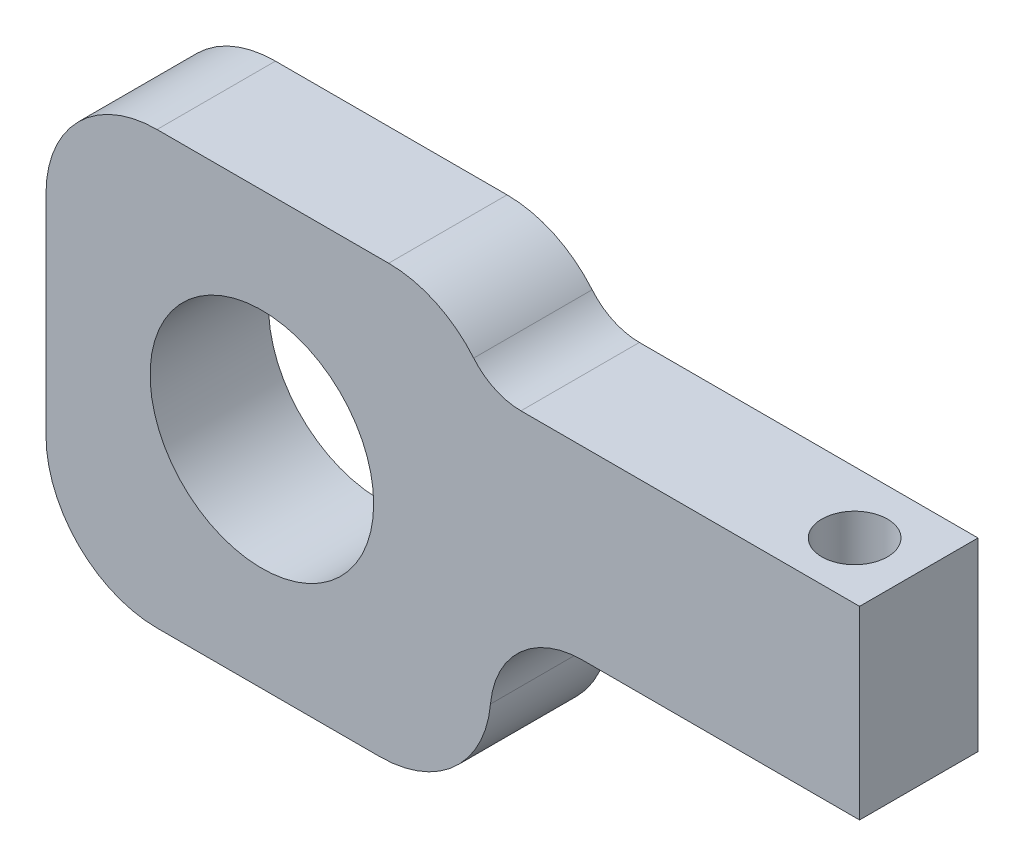
ISO-10303-21;
HEADER;
FILE_DESCRIPTION(('STEP AP214'),'2;1');
FILE_NAME('part.step','',(''),(''),'','','');
FILE_SCHEMA(('AUTOMOTIVE_DESIGN { 1 0 10303 214 1 1 1 1 }'));
ENDSEC;
DATA;
#1=APPLICATION_CONTEXT('core data for automotive mechanical design processes');
#2=APPLICATION_PROTOCOL_DEFINITION('international standard','automotive_design',2000,#1);
#3=PRODUCT_CONTEXT('',#1,'mechanical');
#4=PRODUCT('Part','Part','',(#3));
#5=PRODUCT_RELATED_PRODUCT_CATEGORY('part','',(#4));
#6=PRODUCT_DEFINITION_FORMATION('','',#4);
#7=PRODUCT_DEFINITION_CONTEXT('part definition',#1,'design');
#8=PRODUCT_DEFINITION('design','',#6,#7);
#9=PRODUCT_DEFINITION_SHAPE('','',#8);
#10=(LENGTH_UNIT() NAMED_UNIT(*) SI_UNIT(.MILLI.,.METRE.));
#11=(NAMED_UNIT(*) PLANE_ANGLE_UNIT() SI_UNIT($,.RADIAN.));
#12=(NAMED_UNIT(*) SI_UNIT($,.STERADIAN.) SOLID_ANGLE_UNIT());
#13=UNCERTAINTY_MEASURE_WITH_UNIT(LENGTH_MEASURE(1.E-05),#10,'distance_accuracy_value','');
#14=(GEOMETRIC_REPRESENTATION_CONTEXT(3) GLOBAL_UNCERTAINTY_ASSIGNED_CONTEXT((#13)) GLOBAL_UNIT_ASSIGNED_CONTEXT((#10,
#11,#12)) REPRESENTATION_CONTEXT('',''));
#15=CARTESIAN_POINT('',(0.,0.,0.));
#16=DIRECTION('',(0.,0.,1.));
#17=DIRECTION('',(1.,0.,0.));
#18=AXIS2_PLACEMENT_3D('',#15,#16,#17);
#19=CARTESIAN_POINT('',(0.,0.,6.096));
#20=DIRECTION('',(1.,0.,0.));
#21=DIRECTION('',(0.,1.,0.));
#22=AXIS2_PLACEMENT_3D('',#19,#20,#21);
#23=PLANE('',#22);
#24=DIRECTION('',(0.,-1.,0.));
#25=VECTOR('',#24,1.);
#26=CARTESIAN_POINT('',(0.,0.,-6.096));
#27=LINE('',#26,#25);
#28=CARTESIAN_POINT('',(0.,-11.43,-6.096));
#29=VERTEX_POINT('',#28);
#30=CARTESIAN_POINT('',(0.,-33.02,-6.096));
#31=VERTEX_POINT('',#30);
#32=EDGE_CURVE('E185',#29,#31,#27,.T.);
#33=ORIENTED_EDGE('',*,*,#32,.T.);
#34=DIRECTION('',(0.,0.,-1.));
#35=VECTOR('',#34,1.);
#36=CARTESIAN_POINT('',(0.,-33.02,6.096));
#37=LINE('',#36,#35);
#38=CARTESIAN_POINT('',(0.,-33.02,6.096));
#39=VERTEX_POINT('',#38);
#40=EDGE_CURVE('E11',#31,#39,#37,.F.);
#41=ORIENTED_EDGE('',*,*,#40,.T.);
#42=DIRECTION('',(0.,-1.,0.));
#43=VECTOR('',#42,1.);
#44=CARTESIAN_POINT('',(0.,0.,6.096));
#45=LINE('',#44,#43);
#46=CARTESIAN_POINT('',(0.,-11.43,6.096));
#47=VERTEX_POINT('',#46);
#48=EDGE_CURVE('E186',#47,#39,#45,.T.);
#49=ORIENTED_EDGE('',*,*,#48,.F.);
#50=DIRECTION('',(0.,0.,-1.));
#51=VECTOR('',#50,1.);
#52=CARTESIAN_POINT('',(0.,-11.43,6.096));
#53=LINE('',#52,#51);
#54=EDGE_CURVE('E44',#47,#29,#53,.T.);
#55=ORIENTED_EDGE('',*,*,#54,.T.);
#56=EDGE_LOOP('',(#33,#41,#49,#55));
#57=FACE_BOUND('',#56,.T.);
#58=ADVANCED_FACE('F36',(#57),#23,.F.);
#59=CARTESIAN_POINT('',(0.,-44.45,6.096));
#60=DIRECTION('',(0.,1.,0.));
#61=DIRECTION('',(0.,0.,1.));
#62=AXIS2_PLACEMENT_3D('',#59,#60,#61);
#63=PLANE('',#62);
#64=DIRECTION('',(1.,0.,0.));
#65=VECTOR('',#64,1.);
#66=CARTESIAN_POINT('',(0.,-44.45,-6.096));
#67=LINE('',#66,#65);
#68=CARTESIAN_POINT('',(11.43,-44.45,-6.096));
#69=VERTEX_POINT('',#68);
#70=CARTESIAN_POINT('',(34.3767705590532,-44.45,-6.096));
#71=VERTEX_POINT('',#70);
#72=EDGE_CURVE('E198',#69,#71,#67,.T.);
#73=ORIENTED_EDGE('',*,*,#72,.T.);
#74=DIRECTION('',(0.,0.,1.));
#75=VECTOR('',#74,1.);
#76=CARTESIAN_POINT('',(34.3767705590532,-44.45,6.096));
#77=LINE('',#76,#75);
#78=CARTESIAN_POINT('',(34.3767705590532,-44.45,6.096));
#79=VERTEX_POINT('',#78);
#80=EDGE_CURVE('E226',#71,#79,#77,.T.);
#81=ORIENTED_EDGE('',*,*,#80,.T.);
#82=DIRECTION('',(1.,0.,0.));
#83=VECTOR('',#82,1.);
#84=CARTESIAN_POINT('',(0.,-44.45,6.096));
#85=LINE('',#84,#83);
#86=CARTESIAN_POINT('',(11.43,-44.45,6.096));
#87=VERTEX_POINT('',#86);
#88=EDGE_CURVE('E189',#87,#79,#85,.T.);
#89=ORIENTED_EDGE('',*,*,#88,.F.);
#90=DIRECTION('',(0.,0.,-1.));
#91=VECTOR('',#90,1.);
#92=CARTESIAN_POINT('',(11.43,-44.45,6.096));
#93=LINE('',#92,#91);
#94=EDGE_CURVE('E223',#87,#69,#93,.T.);
#95=ORIENTED_EDGE('',*,*,#94,.T.);
#96=EDGE_LOOP('',(#73,#81,#89,#95));
#97=FACE_BOUND('',#96,.T.);
#98=ADVANCED_FACE('F265',(#97),#63,.F.);
#99=CARTESIAN_POINT('',(0.,0.,6.096));
#100=DIRECTION('',(0.,-1.,0.));
#101=DIRECTION('',(0.,0.,-1.));
#102=AXIS2_PLACEMENT_3D('',#99,#100,#101);
#103=PLANE('',#102);
#104=DIRECTION('',(-1.,0.,0.));
#105=VECTOR('',#104,1.);
#106=CARTESIAN_POINT('',(0.,0.,6.096));
#107=LINE('',#106,#105);
#108=CARTESIAN_POINT('',(35.2757672756502,0.,6.096));
#109=VERTEX_POINT('',#108);
#110=CARTESIAN_POINT('',(11.43,0.,6.096));
#111=VERTEX_POINT('',#110);
#112=EDGE_CURVE('E193',#109,#111,#107,.T.);
#113=ORIENTED_EDGE('',*,*,#112,.F.);
#114=DIRECTION('',(0.,0.,1.));
#115=VECTOR('',#114,1.);
#116=CARTESIAN_POINT('',(35.2757672756502,0.,6.096));
#117=LINE('',#116,#115);
#118=CARTESIAN_POINT('',(35.2757672756502,0.,-6.096));
#119=VERTEX_POINT('',#118);
#120=EDGE_CURVE('E215',#109,#119,#117,.F.);
#121=ORIENTED_EDGE('',*,*,#120,.T.);
#122=DIRECTION('',(-1.,0.,0.));
#123=VECTOR('',#122,1.);
#124=CARTESIAN_POINT('',(0.,0.,-6.096));
#125=LINE('',#124,#123);
#126=CARTESIAN_POINT('',(11.43,0.,-6.096));
#127=VERTEX_POINT('',#126);
#128=EDGE_CURVE('E190',#119,#127,#125,.T.);
#129=ORIENTED_EDGE('',*,*,#128,.T.);
#130=DIRECTION('',(0.,0.,-1.));
#131=VECTOR('',#130,1.);
#132=CARTESIAN_POINT('',(11.43,0.,6.096));
#133=LINE('',#132,#131);
#134=EDGE_CURVE('E213',#127,#111,#133,.F.);
#135=ORIENTED_EDGE('',*,*,#134,.T.);
#136=EDGE_LOOP('',(#113,#121,#129,#135));
#137=FACE_BOUND('',#136,.T.);
#138=ADVANCED_FACE('F239',(#137),#103,.F.);
#139=CARTESIAN_POINT('',(0.,0.,6.096));
#140=DIRECTION('',(0.,0.,1.));
#141=DIRECTION('',(1.,0.,0.));
#142=AXIS2_PLACEMENT_3D('',#139,#140,#141);
#143=PLANE('',#142);
#144=CARTESIAN_POINT('',(48.895,0.,6.096));
#145=DIRECTION('',(0.,0.,1.));
#146=DIRECTION('',(1.,0.,0.));
#147=AXIS2_PLACEMENT_3D('',#144,#145,#146);
#148=CIRCLE('',#147,6.35);
#149=CARTESIAN_POINT('',(44.0309883127322,-4.08214285714286,6.096));
#150=VERTEX_POINT('',#149);
#151=CARTESIAN_POINT('',(48.895,-6.35,6.096));
#152=VERTEX_POINT('',#151);
#153=EDGE_CURVE('E152',#150,#152,#148,.T.);
#154=ORIENTED_EDGE('',*,*,#153,.F.);
#155=CARTESIAN_POINT('',(35.2757672756502,-11.43,6.096));
#156=DIRECTION('',(0.,0.,1.));
#157=DIRECTION('',(1.,0.,0.));
#158=AXIS2_PLACEMENT_3D('',#155,#156,#157);
#159=CIRCLE('',#158,11.43);
#160=EDGE_CURVE('E211',#150,#109,#159,.T.);
#161=ORIENTED_EDGE('',*,*,#160,.T.);
#162=ORIENTED_EDGE('',*,*,#112,.T.);
#163=CARTESIAN_POINT('',(11.43,-11.43,6.096));
#164=DIRECTION('',(0.,0.,1.));
#165=DIRECTION('',(1.,0.,0.));
#166=AXIS2_PLACEMENT_3D('',#163,#164,#165);
#167=CIRCLE('',#166,11.43);
#168=EDGE_CURVE('E205',#111,#47,#167,.T.);
#169=ORIENTED_EDGE('',*,*,#168,.T.);
#170=ORIENTED_EDGE('',*,*,#48,.T.);
#171=CARTESIAN_POINT('',(11.43,-33.02,6.096));
#172=DIRECTION('',(0.,0.,1.));
#173=DIRECTION('',(1.,0.,0.));
#174=AXIS2_PLACEMENT_3D('',#171,#172,#173);
#175=CIRCLE('',#174,11.43);
#176=EDGE_CURVE('E207',#39,#87,#175,.T.);
#177=ORIENTED_EDGE('',*,*,#176,.T.);
#178=ORIENTED_EDGE('',*,*,#88,.T.);
#179=CARTESIAN_POINT('',(34.3767705590532,-33.02,6.096));
#180=DIRECTION('',(0.,0.,1.));
#181=DIRECTION('',(1.,0.,0.));
#182=AXIS2_PLACEMENT_3D('',#179,#180,#181);
#183=CIRCLE('',#182,11.43);
#184=CARTESIAN_POINT('',(45.759441163206,-34.0590909090909,6.096));
#185=VERTEX_POINT('',#184);
#186=EDGE_CURVE('E209',#79,#185,#183,.T.);
#187=ORIENTED_EDGE('',*,*,#186,.T.);
#188=CARTESIAN_POINT('',(55.245,-34.925,6.096));
#189=DIRECTION('',(0.,0.,1.));
#190=DIRECTION('',(1.,0.,0.));
#191=AXIS2_PLACEMENT_3D('',#188,#189,#190);
#192=CIRCLE('',#191,9.52499999999999);
#193=CARTESIAN_POINT('',(55.245,-25.4,6.096));
#194=VERTEX_POINT('',#193);
#195=EDGE_CURVE('E170',#194,#185,#192,.T.);
#196=ORIENTED_EDGE('',*,*,#195,.F.);
#197=DIRECTION('',(-1.,0.,0.));
#198=VECTOR('',#197,1.);
#199=CARTESIAN_POINT('',(96.52,-25.4,6.096));
#200=LINE('',#199,#198);
#201=CARTESIAN_POINT('',(83.7565,-25.4,6.096));
#202=VERTEX_POINT('',#201);
#203=EDGE_CURVE('E144',#202,#194,#200,.T.);
#204=ORIENTED_EDGE('',*,*,#203,.F.);
#205=DIRECTION('',(0.,1.,0.));
#206=VECTOR('',#205,1.);
#207=CARTESIAN_POINT('',(83.7565,-44.45,6.096));
#208=LINE('',#207,#206);
#209=CARTESIAN_POINT('',(83.7565,-6.35,6.096));
#210=VERTEX_POINT('',#209);
#211=EDGE_CURVE('E128',#202,#210,#208,.T.);
#212=ORIENTED_EDGE('',*,*,#211,.T.);
#213=DIRECTION('',(1.,0.,0.));
#214=VECTOR('',#213,1.);
#215=CARTESIAN_POINT('',(48.895,-6.35,6.096));
#216=LINE('',#215,#214);
#217=EDGE_CURVE('E142',#152,#210,#216,.T.);
#218=ORIENTED_EDGE('',*,*,#217,.F.);
#219=EDGE_LOOP('',(#154,#161,#162,#169,#170,#177,#178,#187,#196,#204,#212,#218));
#220=FACE_BOUND('',#219,.T.);
#221=CARTESIAN_POINT('',(22.225,-22.225,6.096));
#222=DIRECTION('',(0.,0.,1.));
#223=DIRECTION('',(1.,0.,0.));
#224=AXIS2_PLACEMENT_3D('',#221,#222,#223);
#225=CIRCLE('',#224,11.50874);
#226=CARTESIAN_POINT('',(33.73374,-22.225,6.096));
#227=VERTEX_POINT('',#226);
#228=EDGE_CURVE('E164',#227,#227,#225,.T.);
#229=ORIENTED_EDGE('',*,*,#228,.F.);
#230=EDGE_LOOP('',(#229));
#231=FACE_BOUND('',#230,.T.);
#232=ADVANCED_FACE('F140',(#220,#231),#143,.T.);
#233=CARTESIAN_POINT('',(0.,0.,-6.096));
#234=DIRECTION('',(0.,0.,1.));
#235=DIRECTION('',(1.,0.,0.));
#236=AXIS2_PLACEMENT_3D('',#233,#234,#235);
#237=PLANE('',#236);
#238=CARTESIAN_POINT('',(22.225,-22.225,-6.096));
#239=DIRECTION('',(0.,0.,1.));
#240=DIRECTION('',(1.,0.,0.));
#241=AXIS2_PLACEMENT_3D('',#238,#239,#240);
#242=CIRCLE('',#241,11.50874);
#243=CARTESIAN_POINT('',(33.73374,-22.225,-6.096));
#244=VERTEX_POINT('',#243);
#245=EDGE_CURVE('E182',#244,#244,#242,.F.);
#246=ORIENTED_EDGE('',*,*,#245,.F.);
#247=EDGE_LOOP('',(#246));
#248=FACE_BOUND('',#247,.T.);
#249=ORIENTED_EDGE('',*,*,#128,.F.);
#250=CARTESIAN_POINT('',(35.2757672756502,-11.43,-6.096));
#251=DIRECTION('',(0.,0.,1.));
#252=DIRECTION('',(1.,0.,0.));
#253=AXIS2_PLACEMENT_3D('',#250,#251,#252);
#254=CIRCLE('',#253,11.43);
#255=CARTESIAN_POINT('',(44.0309883127322,-4.08214285714286,-6.096));
#256=VERTEX_POINT('',#255);
#257=EDGE_CURVE('E221',#119,#256,#254,.F.);
#258=ORIENTED_EDGE('',*,*,#257,.T.);
#259=CARTESIAN_POINT('',(48.895,0.,-6.096));
#260=DIRECTION('',(0.,0.,1.));
#261=DIRECTION('',(1.,0.,0.));
#262=AXIS2_PLACEMENT_3D('',#259,#260,#261);
#263=CIRCLE('',#262,6.35);
#264=CARTESIAN_POINT('',(48.895,-6.35,-6.096));
#265=VERTEX_POINT('',#264);
#266=EDGE_CURVE('E156',#265,#256,#263,.F.);
#267=ORIENTED_EDGE('',*,*,#266,.F.);
#268=DIRECTION('',(-1.,0.,0.));
#269=VECTOR('',#268,1.);
#270=CARTESIAN_POINT('',(48.895,-6.35,-6.096));
#271=LINE('',#270,#269);
#272=CARTESIAN_POINT('',(83.7565,-6.35,-6.096));
#273=VERTEX_POINT('',#272);
#274=EDGE_CURVE('E162',#273,#265,#271,.T.);
#275=ORIENTED_EDGE('',*,*,#274,.F.);
#276=DIRECTION('',(0.,1.,0.));
#277=VECTOR('',#276,1.);
#278=CARTESIAN_POINT('',(83.7565,-44.45,-6.096));
#279=LINE('',#278,#277);
#280=CARTESIAN_POINT('',(83.7565,-25.4,-6.096));
#281=VERTEX_POINT('',#280);
#282=EDGE_CURVE('E131',#281,#273,#279,.T.);
#283=ORIENTED_EDGE('',*,*,#282,.F.);
#284=DIRECTION('',(1.,0.,0.));
#285=VECTOR('',#284,1.);
#286=CARTESIAN_POINT('',(96.52,-25.4,-6.096));
#287=LINE('',#286,#285);
#288=CARTESIAN_POINT('',(55.245,-25.4,-6.096));
#289=VERTEX_POINT('',#288);
#290=EDGE_CURVE('E167',#289,#281,#287,.T.);
#291=ORIENTED_EDGE('',*,*,#290,.F.);
#292=CARTESIAN_POINT('',(55.245,-34.925,-6.096));
#293=DIRECTION('',(0.,0.,1.));
#294=DIRECTION('',(1.,0.,0.));
#295=AXIS2_PLACEMENT_3D('',#292,#293,#294);
#296=CIRCLE('',#295,9.52499999999999);
#297=CARTESIAN_POINT('',(45.759441163206,-34.0590909090909,-6.096));
#298=VERTEX_POINT('',#297);
#299=EDGE_CURVE('E165',#298,#289,#296,.F.);
#300=ORIENTED_EDGE('',*,*,#299,.F.);
#301=CARTESIAN_POINT('',(34.3767705590532,-33.02,-6.096));
#302=DIRECTION('',(0.,0.,1.));
#303=DIRECTION('',(1.,0.,0.));
#304=AXIS2_PLACEMENT_3D('',#301,#302,#303);
#305=CIRCLE('',#304,11.43);
#306=EDGE_CURVE('E219',#298,#71,#305,.F.);
#307=ORIENTED_EDGE('',*,*,#306,.T.);
#308=ORIENTED_EDGE('',*,*,#72,.F.);
#309=CARTESIAN_POINT('',(11.43,-33.02,-6.096));
#310=DIRECTION('',(0.,0.,1.));
#311=DIRECTION('',(1.,0.,0.));
#312=AXIS2_PLACEMENT_3D('',#309,#310,#311);
#313=CIRCLE('',#312,11.43);
#314=EDGE_CURVE('E51',#69,#31,#313,.F.);
#315=ORIENTED_EDGE('',*,*,#314,.T.);
#316=ORIENTED_EDGE('',*,*,#32,.F.);
#317=CARTESIAN_POINT('',(11.43,-11.43,-6.096));
#318=DIRECTION('',(0.,0.,1.));
#319=DIRECTION('',(1.,0.,0.));
#320=AXIS2_PLACEMENT_3D('',#317,#318,#319);
#321=CIRCLE('',#320,11.43);
#322=EDGE_CURVE('E59',#29,#127,#321,.F.);
#323=ORIENTED_EDGE('',*,*,#322,.T.);
#324=EDGE_LOOP('',(#249,#258,#267,#275,#283,#291,#300,#307,#308,#315,#316,#323));
#325=FACE_BOUND('',#324,.T.);
#326=ADVANCED_FACE('F235',(#248,#325),#237,.F.);
#327=CARTESIAN_POINT('',(22.225,-22.225,-6.097));
#328=DIRECTION('',(0.,0.,1.));
#329=DIRECTION('',(1.,0.,0.));
#330=AXIS2_PLACEMENT_3D('',#327,#328,#329);
#331=CYLINDRICAL_SURFACE('',#330,11.50874);
#332=ORIENTED_EDGE('',*,*,#228,.T.);
#333=EDGE_LOOP('',(#332));
#334=FACE_BOUND('',#333,.T.);
#335=ORIENTED_EDGE('',*,*,#245,.T.);
#336=EDGE_LOOP('',(#335));
#337=FACE_BOUND('',#336,.T.);
#338=ADVANCED_FACE('F303',(#334,#337),#331,.F.);
#339=CARTESIAN_POINT('',(55.245,-34.925,-6.097));
#340=DIRECTION('',(0.,0.,1.));
#341=DIRECTION('',(1.,0.,0.));
#342=AXIS2_PLACEMENT_3D('',#339,#340,#341);
#343=CYLINDRICAL_SURFACE('',#342,9.52499999999999);
#344=ORIENTED_EDGE('',*,*,#195,.T.);
#345=DIRECTION('',(0.,0.,1.));
#346=VECTOR('',#345,1.);
#347=CARTESIAN_POINT('',(45.759441163206,-34.0590909090909,-6.097));
#348=LINE('',#347,#346);
#349=EDGE_CURVE('E229',#185,#298,#348,.F.);
#350=ORIENTED_EDGE('',*,*,#349,.T.);
#351=ORIENTED_EDGE('',*,*,#299,.T.);
#352=DIRECTION('',(0.,0.,1.));
#353=VECTOR('',#352,1.);
#354=CARTESIAN_POINT('',(55.245,-25.4,-6.097));
#355=LINE('',#354,#353);
#356=EDGE_CURVE('E174',#289,#194,#355,.T.);
#357=ORIENTED_EDGE('',*,*,#356,.T.);
#358=EDGE_LOOP('',(#344,#350,#351,#357));
#359=FACE_BOUND('',#358,.T.);
#360=ADVANCED_FACE('F301',(#359),#343,.F.);
#361=CARTESIAN_POINT('',(96.52,-25.4,-6.097));
#362=DIRECTION('',(0.,1.,0.));
#363=DIRECTION('',(-1.,0.,0.));
#364=AXIS2_PLACEMENT_3D('',#361,#362,#363);
#365=PLANE('',#364);
#366=ORIENTED_EDGE('',*,*,#290,.T.);
#367=DIRECTION('',(0.,0.,1.));
#368=VECTOR('',#367,1.);
#369=CARTESIAN_POINT('',(83.7565,-25.4,-6.097));
#370=LINE('',#369,#368);
#371=EDGE_CURVE('E145',#281,#202,#370,.T.);
#372=ORIENTED_EDGE('',*,*,#371,.T.);
#373=ORIENTED_EDGE('',*,*,#203,.T.);
#374=ORIENTED_EDGE('',*,*,#356,.F.);
#375=EDGE_LOOP('',(#366,#372,#373,#374));
#376=FACE_BOUND('',#375,.T.);
#377=CARTESIAN_POINT('',(77.4065,-25.4,0.254));
#378=DIRECTION('',(0.,1.,0.));
#379=DIRECTION('',(-1.,0.,0.));
#380=AXIS2_PLACEMENT_3D('',#377,#378,#379);
#381=CIRCLE('',#380,3.37819999999999);
#382=CARTESIAN_POINT('',(74.0283,-25.4,0.254));
#383=VERTEX_POINT('',#382);
#384=EDGE_CURVE('E171',#383,#383,#381,.T.);
#385=ORIENTED_EDGE('',*,*,#384,.T.);
#386=EDGE_LOOP('',(#385));
#387=FACE_BOUND('',#386,.T.);
#388=ADVANCED_FACE('F252',(#376,#387),#365,.F.);
#389=CARTESIAN_POINT('',(48.895,0.,-6.097));
#390=DIRECTION('',(0.,0.,1.));
#391=DIRECTION('',(1.,0.,0.));
#392=AXIS2_PLACEMENT_3D('',#389,#390,#391);
#393=CYLINDRICAL_SURFACE('',#392,6.35);
#394=ORIENTED_EDGE('',*,*,#266,.T.);
#395=DIRECTION('',(0.,0.,1.));
#396=VECTOR('',#395,1.);
#397=CARTESIAN_POINT('',(44.0309883127322,-4.08214285714286,-6.097));
#398=LINE('',#397,#396);
#399=EDGE_CURVE('E196',#256,#150,#398,.T.);
#400=ORIENTED_EDGE('',*,*,#399,.T.);
#401=ORIENTED_EDGE('',*,*,#153,.T.);
#402=DIRECTION('',(0.,0.,1.));
#403=VECTOR('',#402,1.);
#404=CARTESIAN_POINT('',(48.895,-6.35,-6.097));
#405=LINE('',#404,#403);
#406=EDGE_CURVE('E151',#265,#152,#405,.T.);
#407=ORIENTED_EDGE('',*,*,#406,.F.);
#408=EDGE_LOOP('',(#394,#400,#401,#407));
#409=FACE_BOUND('',#408,.T.);
#410=ADVANCED_FACE('F248',(#409),#393,.F.);
#411=CARTESIAN_POINT('',(48.895,-6.35,-6.097));
#412=DIRECTION('',(0.,-1.,0.));
#413=DIRECTION('',(0.,0.,-1.));
#414=AXIS2_PLACEMENT_3D('',#411,#412,#413);
#415=PLANE('',#414);
#416=ORIENTED_EDGE('',*,*,#217,.T.);
#417=DIRECTION('',(0.,0.,1.));
#418=VECTOR('',#417,1.);
#419=CARTESIAN_POINT('',(83.7565,-6.35,6.096));
#420=LINE('',#419,#418);
#421=EDGE_CURVE('E125',#273,#210,#420,.T.);
#422=ORIENTED_EDGE('',*,*,#421,.F.);
#423=ORIENTED_EDGE('',*,*,#274,.T.);
#424=ORIENTED_EDGE('',*,*,#406,.T.);
#425=EDGE_LOOP('',(#416,#422,#423,#424));
#426=FACE_BOUND('',#425,.T.);
#427=CARTESIAN_POINT('',(77.4065,-6.35,0.254));
#428=DIRECTION('',(0.,-1.,0.));
#429=DIRECTION('',(0.,0.,-1.));
#430=AXIS2_PLACEMENT_3D('',#427,#428,#429);
#431=CIRCLE('',#430,3.37819999999999);
#432=CARTESIAN_POINT('',(77.4065,-6.35,-3.12419999999999));
#433=VERTEX_POINT('',#432);
#434=EDGE_CURVE('E154',#433,#433,#431,.T.);
#435=ORIENTED_EDGE('',*,*,#434,.T.);
#436=EDGE_LOOP('',(#435));
#437=FACE_BOUND('',#436,.T.);
#438=ADVANCED_FACE('F148',(#426,#437),#415,.F.);
#439=CARTESIAN_POINT('',(77.4065,-44.451,0.254));
#440=DIRECTION('',(0.,1.,0.));
#441=DIRECTION('',(0.,0.,1.));
#442=AXIS2_PLACEMENT_3D('',#439,#440,#441);
#443=CYLINDRICAL_SURFACE('',#442,3.37819999999999);
#444=ORIENTED_EDGE('',*,*,#434,.F.);
#445=EDGE_LOOP('',(#444));
#446=FACE_BOUND('',#445,.T.);
#447=ORIENTED_EDGE('',*,*,#384,.F.);
#448=EDGE_LOOP('',(#447));
#449=FACE_BOUND('',#448,.T.);
#450=ADVANCED_FACE('F287',(#446,#449),#443,.F.);
#451=CARTESIAN_POINT('',(83.7565,-44.45,6.096));
#452=DIRECTION('',(-1.,0.,0.));
#453=DIRECTION('',(0.,0.,1.));
#454=AXIS2_PLACEMENT_3D('',#451,#452,#453);
#455=PLANE('',#454);
#456=ORIENTED_EDGE('',*,*,#282,.T.);
#457=ORIENTED_EDGE('',*,*,#421,.T.);
#458=ORIENTED_EDGE('',*,*,#211,.F.);
#459=ORIENTED_EDGE('',*,*,#371,.F.);
#460=EDGE_LOOP('',(#456,#457,#458,#459));
#461=FACE_BOUND('',#460,.T.);
#462=ADVANCED_FACE('F127',(#461),#455,.F.);
#463=CARTESIAN_POINT('',(35.2757672756502,-11.43,-6.097));
#464=DIRECTION('',(0.,0.,1.));
#465=DIRECTION('',(1.,0.,0.));
#466=AXIS2_PLACEMENT_3D('',#463,#464,#465);
#467=CYLINDRICAL_SURFACE('',#466,11.43);
#468=ORIENTED_EDGE('',*,*,#257,.F.);
#469=ORIENTED_EDGE('',*,*,#120,.F.);
#470=ORIENTED_EDGE('',*,*,#160,.F.);
#471=ORIENTED_EDGE('',*,*,#399,.F.);
#472=EDGE_LOOP('',(#468,#469,#470,#471));
#473=FACE_BOUND('',#472,.T.);
#474=ADVANCED_FACE('F243',(#473),#467,.T.);
#475=CARTESIAN_POINT('',(34.3767705590532,-33.02,-6.097));
#476=DIRECTION('',(0.,0.,1.));
#477=DIRECTION('',(1.,0.,0.));
#478=AXIS2_PLACEMENT_3D('',#475,#476,#477);
#479=CYLINDRICAL_SURFACE('',#478,11.43);
#480=ORIENTED_EDGE('',*,*,#306,.F.);
#481=ORIENTED_EDGE('',*,*,#349,.F.);
#482=ORIENTED_EDGE('',*,*,#186,.F.);
#483=ORIENTED_EDGE('',*,*,#80,.F.);
#484=EDGE_LOOP('',(#480,#481,#482,#483));
#485=FACE_BOUND('',#484,.T.);
#486=ADVANCED_FACE('F262',(#485),#479,.T.);
#487=CARTESIAN_POINT('',(11.43,-33.02,6.096));
#488=DIRECTION('',(0.,0.,-1.));
#489=DIRECTION('',(-1.,0.,0.));
#490=AXIS2_PLACEMENT_3D('',#487,#488,#489);
#491=CYLINDRICAL_SURFACE('',#490,11.43);
#492=ORIENTED_EDGE('',*,*,#176,.F.);
#493=ORIENTED_EDGE('',*,*,#40,.F.);
#494=ORIENTED_EDGE('',*,*,#314,.F.);
#495=ORIENTED_EDGE('',*,*,#94,.F.);
#496=EDGE_LOOP('',(#492,#493,#494,#495));
#497=FACE_BOUND('',#496,.T.);
#498=ADVANCED_FACE('F268',(#497),#491,.T.);
#499=CARTESIAN_POINT('',(11.43,-11.43,6.096));
#500=DIRECTION('',(0.,0.,-1.));
#501=DIRECTION('',(-1.,0.,0.));
#502=AXIS2_PLACEMENT_3D('',#499,#500,#501);
#503=CYLINDRICAL_SURFACE('',#502,11.43);
#504=ORIENTED_EDGE('',*,*,#168,.F.);
#505=ORIENTED_EDGE('',*,*,#134,.F.);
#506=ORIENTED_EDGE('',*,*,#322,.F.);
#507=ORIENTED_EDGE('',*,*,#54,.F.);
#508=EDGE_LOOP('',(#504,#505,#506,#507));
#509=FACE_BOUND('',#508,.T.);
#510=ADVANCED_FACE('F38',(#509),#503,.T.);
#511=CLOSED_SHELL('',(#58,#98,#138,#232,#326,#338,#360,#388,#410,#438,#450,#462,#474,#486,#498,#510));
#512=MANIFOLD_SOLID_BREP('B2',#511);
#513=ADVANCED_BREP_SHAPE_REPRESENTATION('',(#18,#512),#14);
#514=SHAPE_DEFINITION_REPRESENTATION(#9,#513);
ENDSEC;
END-ISO-10303-21;
